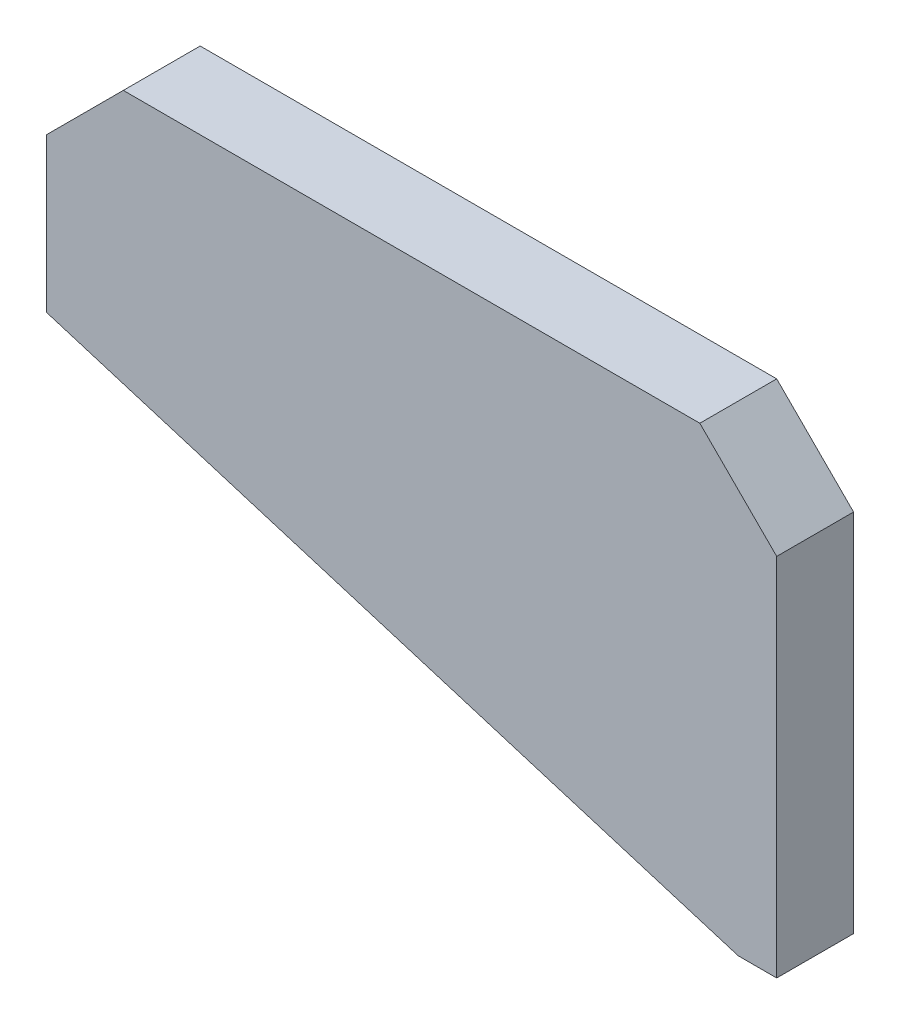
ISO-10303-21;
HEADER;
FILE_DESCRIPTION(('STEP AP214'),'2;1');
FILE_NAME('part.step','',(''),(''),'','','');
FILE_SCHEMA(('AUTOMOTIVE_DESIGN { 1 0 10303 214 1 1 1 1 }'));
ENDSEC;
DATA;
#1=APPLICATION_CONTEXT('core data for automotive mechanical design processes');
#2=APPLICATION_PROTOCOL_DEFINITION('international standard','automotive_design',2000,#1);
#3=PRODUCT_CONTEXT('',#1,'mechanical');
#4=PRODUCT('Part','Part','',(#3));
#5=PRODUCT_RELATED_PRODUCT_CATEGORY('part','',(#4));
#6=PRODUCT_DEFINITION_FORMATION('','',#4);
#7=PRODUCT_DEFINITION_CONTEXT('part definition',#1,'design');
#8=PRODUCT_DEFINITION('design','',#6,#7);
#9=PRODUCT_DEFINITION_SHAPE('','',#8);
#10=(LENGTH_UNIT() NAMED_UNIT(*) SI_UNIT(.MILLI.,.METRE.));
#11=(NAMED_UNIT(*) PLANE_ANGLE_UNIT() SI_UNIT($,.RADIAN.));
#12=(NAMED_UNIT(*) SI_UNIT($,.STERADIAN.) SOLID_ANGLE_UNIT());
#13=UNCERTAINTY_MEASURE_WITH_UNIT(LENGTH_MEASURE(1.E-05),#10,'distance_accuracy_value','');
#14=(GEOMETRIC_REPRESENTATION_CONTEXT(3) GLOBAL_UNCERTAINTY_ASSIGNED_CONTEXT((#13)) GLOBAL_UNIT_ASSIGNED_CONTEXT((#10,
#11,#12)) REPRESENTATION_CONTEXT('',''));
#15=CARTESIAN_POINT('',(0.,0.,0.));
#16=DIRECTION('',(0.,0.,1.));
#17=DIRECTION('',(1.,0.,0.));
#18=AXIS2_PLACEMENT_3D('',#15,#16,#17);
#19=CARTESIAN_POINT('',(-95.,-30.,-5.));
#20=DIRECTION('',(-1.,0.,0.));
#21=DIRECTION('',(0.,0.,1.));
#22=AXIS2_PLACEMENT_3D('',#19,#20,#21);
#23=PLANE('',#22);
#24=DIRECTION('',(0.,-1.,0.));
#25=VECTOR('',#24,1.);
#26=CARTESIAN_POINT('',(-95.,-30.,5.));
#27=LINE('',#26,#25);
#28=CARTESIAN_POINT('',(-95.,-10.,5.));
#29=VERTEX_POINT('',#28);
#30=CARTESIAN_POINT('',(-95.,-30.,5.));
#31=VERTEX_POINT('',#30);
#32=EDGE_CURVE('E145',#29,#31,#27,.T.);
#33=ORIENTED_EDGE('',*,*,#32,.F.);
#34=DIRECTION('',(0.,0.,-1.));
#35=VECTOR('',#34,1.);
#36=CARTESIAN_POINT('',(-95.,-10.,-5.));
#37=LINE('',#36,#35);
#38=CARTESIAN_POINT('',(-95.,-10.,-5.));
#39=VERTEX_POINT('',#38);
#40=EDGE_CURVE('E73',#29,#39,#37,.T.);
#41=ORIENTED_EDGE('',*,*,#40,.T.);
#42=DIRECTION('',(0.,-1.,0.));
#43=VECTOR('',#42,1.);
#44=CARTESIAN_POINT('',(-95.,-30.,-5.));
#45=LINE('',#44,#43);
#46=CARTESIAN_POINT('',(-95.,-30.,-5.));
#47=VERTEX_POINT('',#46);
#48=EDGE_CURVE('E110',#39,#47,#45,.T.);
#49=ORIENTED_EDGE('',*,*,#48,.T.);
#50=DIRECTION('',(0.,0.,1.));
#51=VECTOR('',#50,1.);
#52=CARTESIAN_POINT('',(-95.,-30.,-5.));
#53=LINE('',#52,#51);
#54=EDGE_CURVE('E112',#47,#31,#53,.T.);
#55=ORIENTED_EDGE('',*,*,#54,.T.);
#56=EDGE_LOOP('',(#33,#41,#49,#55));
#57=FACE_BOUND('',#56,.T.);
#58=ADVANCED_FACE('F48',(#57),#23,.T.);
#59=CARTESIAN_POINT('',(-95.,0.,-5.));
#60=DIRECTION('',(0.,1.,0.));
#61=DIRECTION('',(0.,0.,1.));
#62=AXIS2_PLACEMENT_3D('',#59,#60,#61);
#63=PLANE('',#62);
#64=DIRECTION('',(-1.,0.,0.));
#65=VECTOR('',#64,1.);
#66=CARTESIAN_POINT('',(-95.,0.,-5.));
#67=LINE('',#66,#65);
#68=CARTESIAN_POINT('',(-10.,0.,-5.));
#69=VERTEX_POINT('',#68);
#70=CARTESIAN_POINT('',(-85.,0.,-5.));
#71=VERTEX_POINT('',#70);
#72=EDGE_CURVE('E127',#69,#71,#67,.T.);
#73=ORIENTED_EDGE('',*,*,#72,.T.);
#74=DIRECTION('',(0.,0.,1.));
#75=VECTOR('',#74,1.);
#76=CARTESIAN_POINT('',(-85.,0.,-5.));
#77=LINE('',#76,#75);
#78=CARTESIAN_POINT('',(-85.,0.,5.));
#79=VERTEX_POINT('',#78);
#80=EDGE_CURVE('E169',#71,#79,#77,.T.);
#81=ORIENTED_EDGE('',*,*,#80,.T.);
#82=DIRECTION('',(-1.,0.,0.));
#83=VECTOR('',#82,1.);
#84=CARTESIAN_POINT('',(-95.,0.,5.));
#85=LINE('',#84,#83);
#86=CARTESIAN_POINT('',(-10.,0.,5.));
#87=VERTEX_POINT('',#86);
#88=EDGE_CURVE('E118',#87,#79,#85,.T.);
#89=ORIENTED_EDGE('',*,*,#88,.F.);
#90=DIRECTION('',(0.,0.,-1.));
#91=VECTOR('',#90,1.);
#92=CARTESIAN_POINT('',(-10.,0.,-5.));
#93=LINE('',#92,#91);
#94=EDGE_CURVE('E164',#87,#69,#93,.T.);
#95=ORIENTED_EDGE('',*,*,#94,.T.);
#96=EDGE_LOOP('',(#73,#81,#89,#95));
#97=FACE_BOUND('',#96,.T.);
#98=ADVANCED_FACE('F187',(#97),#63,.T.);
#99=CARTESIAN_POINT('',(0.,0.,-5.));
#100=DIRECTION('',(1.,0.,0.));
#101=DIRECTION('',(0.,1.,0.));
#102=AXIS2_PLACEMENT_3D('',#99,#100,#101);
#103=PLANE('',#102);
#104=DIRECTION('',(0.,1.,0.));
#105=VECTOR('',#104,1.);
#106=CARTESIAN_POINT('',(0.,0.,-5.));
#107=LINE('',#106,#105);
#108=CARTESIAN_POINT('',(0.,-57.5,-5.));
#109=VERTEX_POINT('',#108);
#110=CARTESIAN_POINT('',(0.,-10.,-5.));
#111=VERTEX_POINT('',#110);
#112=EDGE_CURVE('E137',#109,#111,#107,.T.);
#113=ORIENTED_EDGE('',*,*,#112,.T.);
#114=DIRECTION('',(0.,0.,1.));
#115=VECTOR('',#114,1.);
#116=CARTESIAN_POINT('',(0.,-10.,-5.));
#117=LINE('',#116,#115);
#118=CARTESIAN_POINT('',(0.,-10.,5.));
#119=VERTEX_POINT('',#118);
#120=EDGE_CURVE('E11',#111,#119,#117,.T.);
#121=ORIENTED_EDGE('',*,*,#120,.T.);
#122=DIRECTION('',(0.,1.,0.));
#123=VECTOR('',#122,1.);
#124=CARTESIAN_POINT('',(0.,0.,5.));
#125=LINE('',#124,#123);
#126=CARTESIAN_POINT('',(0.,-57.5,5.));
#127=VERTEX_POINT('',#126);
#128=EDGE_CURVE('E154',#127,#119,#125,.T.);
#129=ORIENTED_EDGE('',*,*,#128,.F.);
#130=DIRECTION('',(0.,0.,1.));
#131=VECTOR('',#130,1.);
#132=CARTESIAN_POINT('',(0.,-57.5,-5.));
#133=LINE('',#132,#131);
#134=EDGE_CURVE('E161',#109,#127,#133,.T.);
#135=ORIENTED_EDGE('',*,*,#134,.F.);
#136=EDGE_LOOP('',(#113,#121,#129,#135));
#137=FACE_BOUND('',#136,.T.);
#138=ADVANCED_FACE('F197',(#137),#103,.T.);
#139=CARTESIAN_POINT('',(0.,-57.5,-5.));
#140=DIRECTION('',(0.,-1.,0.));
#141=DIRECTION('',(0.,0.,-1.));
#142=AXIS2_PLACEMENT_3D('',#139,#140,#141);
#143=PLANE('',#142);
#144=DIRECTION('',(1.,0.,0.));
#145=VECTOR('',#144,1.);
#146=CARTESIAN_POINT('',(0.,-57.5,5.));
#147=LINE('',#146,#145);
#148=CARTESIAN_POINT('',(-4.99999999999999,-57.5,5.));
#149=VERTEX_POINT('',#148);
#150=EDGE_CURVE('E150',#149,#127,#147,.T.);
#151=ORIENTED_EDGE('',*,*,#150,.F.);
#152=DIRECTION('',(0.,0.,1.));
#153=VECTOR('',#152,1.);
#154=CARTESIAN_POINT('',(-4.99999999999999,-57.5,-5.));
#155=LINE('',#154,#153);
#156=CARTESIAN_POINT('',(-4.99999999999999,-57.5,-5.));
#157=VERTEX_POINT('',#156);
#158=EDGE_CURVE('E126',#157,#149,#155,.T.);
#159=ORIENTED_EDGE('',*,*,#158,.F.);
#160=DIRECTION('',(1.,0.,0.));
#161=VECTOR('',#160,1.);
#162=CARTESIAN_POINT('',(0.,-57.5,-5.));
#163=LINE('',#162,#161);
#164=EDGE_CURVE('E132',#157,#109,#163,.T.);
#165=ORIENTED_EDGE('',*,*,#164,.T.);
#166=ORIENTED_EDGE('',*,*,#134,.T.);
#167=EDGE_LOOP('',(#151,#159,#165,#166));
#168=FACE_BOUND('',#167,.T.);
#169=ADVANCED_FACE('F200',(#168),#143,.T.);
#170=CARTESIAN_POINT('',(-4.99999999999999,-57.5,-5.));
#171=DIRECTION('',(-0.29221853559902,-0.956351571051339,0.));
#172=DIRECTION('',(0.956351571051339,-0.29221853559902,0.));
#173=AXIS2_PLACEMENT_3D('',#170,#171,#172);
#174=PLANE('',#173);
#175=DIRECTION('',(0.956351571051339,-0.29221853559902,0.));
#176=VECTOR('',#175,1.);
#177=CARTESIAN_POINT('',(-4.99999999999999,-57.5,5.));
#178=LINE('',#177,#176);
#179=EDGE_CURVE('E124',#31,#149,#178,.T.);
#180=ORIENTED_EDGE('',*,*,#179,.F.);
#181=ORIENTED_EDGE('',*,*,#54,.F.);
#182=DIRECTION('',(0.956351571051339,-0.29221853559902,0.));
#183=VECTOR('',#182,1.);
#184=CARTESIAN_POINT('',(-4.99999999999999,-57.5,-5.));
#185=LINE('',#184,#183);
#186=EDGE_CURVE('E117',#47,#157,#185,.T.);
#187=ORIENTED_EDGE('',*,*,#186,.T.);
#188=ORIENTED_EDGE('',*,*,#158,.T.);
#189=EDGE_LOOP('',(#180,#181,#187,#188));
#190=FACE_BOUND('',#189,.T.);
#191=ADVANCED_FACE('F122',(#190),#174,.T.);
#192=CARTESIAN_POINT('',(0.,0.,-5.));
#193=DIRECTION('',(0.,0.,-1.));
#194=DIRECTION('',(-1.,0.,0.));
#195=AXIS2_PLACEMENT_3D('',#192,#193,#194);
#196=PLANE('',#195);
#197=ORIENTED_EDGE('',*,*,#48,.F.);
#198=DIRECTION('',(-0.707106781186546,-0.70710678118655,0.));
#199=VECTOR('',#198,1.);
#200=CARTESIAN_POINT('',(-42.5000000000002,42.5,-5.));
#201=LINE('',#200,#199);
#202=EDGE_CURVE('E58',#39,#71,#201,.F.);
#203=ORIENTED_EDGE('',*,*,#202,.T.);
#204=ORIENTED_EDGE('',*,*,#72,.F.);
#205=DIRECTION('',(-0.707106781186549,0.707106781186546,0.));
#206=VECTOR('',#205,1.);
#207=CARTESIAN_POINT('',(-5.,-5.00000000000002,-5.));
#208=LINE('',#207,#206);
#209=EDGE_CURVE('E65',#69,#111,#208,.F.);
#210=ORIENTED_EDGE('',*,*,#209,.T.);
#211=ORIENTED_EDGE('',*,*,#112,.F.);
#212=ORIENTED_EDGE('',*,*,#164,.F.);
#213=ORIENTED_EDGE('',*,*,#186,.F.);
#214=EDGE_LOOP('',(#197,#203,#204,#210,#211,#212,#213));
#215=FACE_BOUND('',#214,.T.);
#216=ADVANCED_FACE('F130',(#215),#196,.T.);
#217=CARTESIAN_POINT('',(0.,0.,5.));
#218=DIRECTION('',(0.,0.,-1.));
#219=DIRECTION('',(-1.,0.,0.));
#220=AXIS2_PLACEMENT_3D('',#217,#218,#219);
#221=PLANE('',#220);
#222=ORIENTED_EDGE('',*,*,#88,.T.);
#223=DIRECTION('',(0.707106781186546,0.70710678118655,0.));
#224=VECTOR('',#223,1.);
#225=CARTESIAN_POINT('',(-85.,0.,5.));
#226=LINE('',#225,#224);
#227=EDGE_CURVE('E176',#79,#29,#226,.F.);
#228=ORIENTED_EDGE('',*,*,#227,.T.);
#229=ORIENTED_EDGE('',*,*,#32,.T.);
#230=ORIENTED_EDGE('',*,*,#179,.T.);
#231=ORIENTED_EDGE('',*,*,#150,.T.);
#232=ORIENTED_EDGE('',*,*,#128,.T.);
#233=DIRECTION('',(0.707106781186549,-0.707106781186546,0.));
#234=VECTOR('',#233,1.);
#235=CARTESIAN_POINT('',(0.,-10.,5.));
#236=LINE('',#235,#234);
#237=EDGE_CURVE('E173',#119,#87,#236,.F.);
#238=ORIENTED_EDGE('',*,*,#237,.T.);
#239=EDGE_LOOP('',(#222,#228,#229,#230,#231,#232,#238));
#240=FACE_BOUND('',#239,.T.);
#241=ADVANCED_FACE('F192',(#240),#221,.F.);
#242=CARTESIAN_POINT('',(-85.,0.,-5.));
#243=DIRECTION('',(0.70710678118655,-0.707106781186546,0.));
#244=DIRECTION('',(0.,0.,1.));
#245=AXIS2_PLACEMENT_3D('',#242,#243,#244);
#246=PLANE('',#245);
#247=ORIENTED_EDGE('',*,*,#202,.F.);
#248=ORIENTED_EDGE('',*,*,#40,.F.);
#249=ORIENTED_EDGE('',*,*,#227,.F.);
#250=ORIENTED_EDGE('',*,*,#80,.F.);
#251=EDGE_LOOP('',(#247,#248,#249,#250));
#252=FACE_BOUND('',#251,.T.);
#253=ADVANCED_FACE('F190',(#252),#246,.F.);
#254=CARTESIAN_POINT('',(0.,-10.,-5.));
#255=DIRECTION('',(-0.707106781186546,-0.707106781186549,0.));
#256=DIRECTION('',(0.,0.,1.));
#257=AXIS2_PLACEMENT_3D('',#254,#255,#256);
#258=PLANE('',#257);
#259=ORIENTED_EDGE('',*,*,#209,.F.);
#260=ORIENTED_EDGE('',*,*,#94,.F.);
#261=ORIENTED_EDGE('',*,*,#237,.F.);
#262=ORIENTED_EDGE('',*,*,#120,.F.);
#263=EDGE_LOOP('',(#259,#260,#261,#262));
#264=FACE_BOUND('',#263,.T.);
#265=ADVANCED_FACE('F51',(#264),#258,.F.);
#266=CLOSED_SHELL('',(#58,#98,#138,#169,#191,#216,#241,#253,#265));
#267=MANIFOLD_SOLID_BREP('B2',#266);
#268=ADVANCED_BREP_SHAPE_REPRESENTATION('',(#18,#267),#14);
#269=SHAPE_DEFINITION_REPRESENTATION(#9,#268);
ENDSEC;
END-ISO-10303-21;
